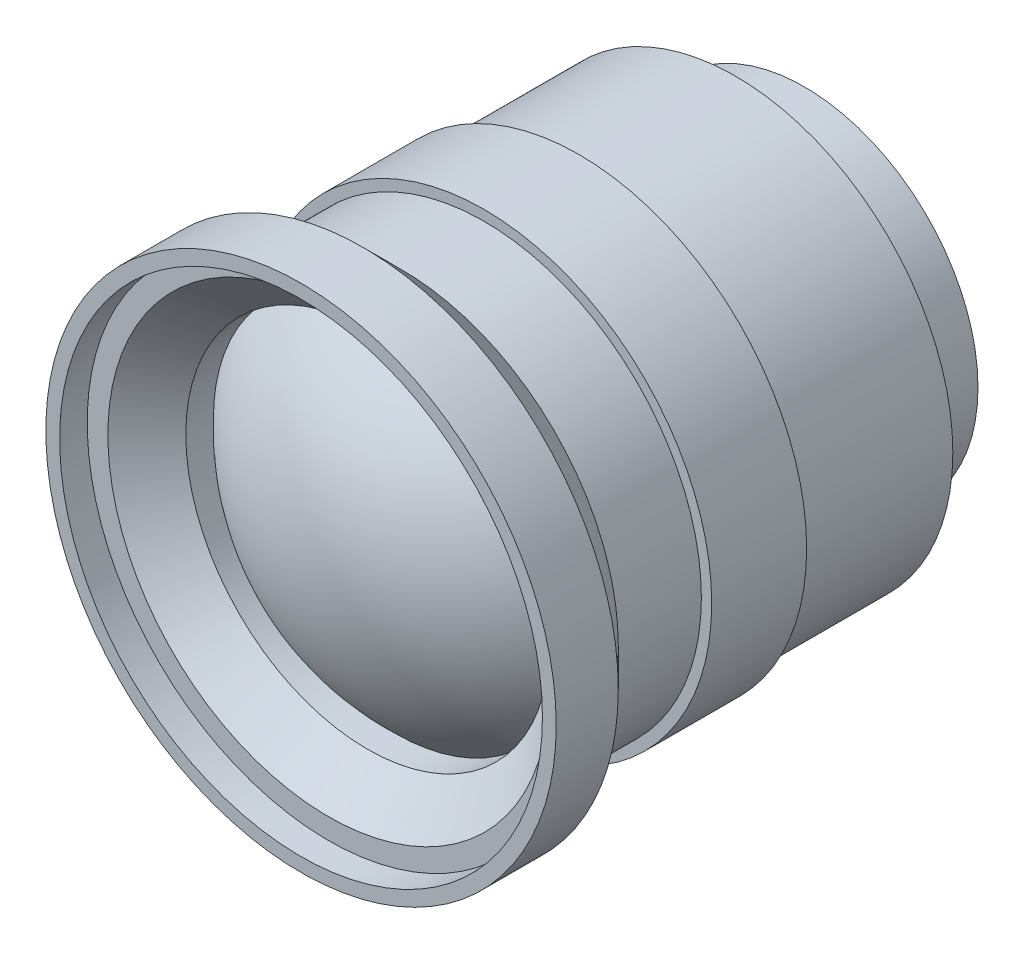
ISO-10303-21;
HEADER;
FILE_DESCRIPTION(('STEP AP214'),'2;1');
FILE_NAME('part.step','',(''),(''),'','','');
FILE_SCHEMA(('AUTOMOTIVE_DESIGN { 1 0 10303 214 1 1 1 1 }'));
ENDSEC;
DATA;
#1=APPLICATION_CONTEXT('core data for automotive mechanical design processes');
#2=APPLICATION_PROTOCOL_DEFINITION('international standard','automotive_design',2000,#1);
#3=PRODUCT_CONTEXT('',#1,'mechanical');
#4=PRODUCT('Part','Part','',(#3));
#5=PRODUCT_RELATED_PRODUCT_CATEGORY('part','',(#4));
#6=PRODUCT_DEFINITION_FORMATION('','',#4);
#7=PRODUCT_DEFINITION_CONTEXT('part definition',#1,'design');
#8=PRODUCT_DEFINITION('design','',#6,#7);
#9=PRODUCT_DEFINITION_SHAPE('','',#8);
#10=(LENGTH_UNIT() NAMED_UNIT(*) SI_UNIT(.MILLI.,.METRE.));
#11=(NAMED_UNIT(*) PLANE_ANGLE_UNIT() SI_UNIT($,.RADIAN.));
#12=(NAMED_UNIT(*) SI_UNIT($,.STERADIAN.) SOLID_ANGLE_UNIT());
#13=UNCERTAINTY_MEASURE_WITH_UNIT(LENGTH_MEASURE(1.E-05),#10,'distance_accuracy_value','');
#14=(GEOMETRIC_REPRESENTATION_CONTEXT(3) GLOBAL_UNCERTAINTY_ASSIGNED_CONTEXT((#13)) GLOBAL_UNIT_ASSIGNED_CONTEXT((#10,
#11,#12)) REPRESENTATION_CONTEXT('',''));
#15=CARTESIAN_POINT('',(0.,0.,0.));
#16=DIRECTION('',(0.,0.,1.));
#17=DIRECTION('',(1.,0.,0.));
#18=AXIS2_PLACEMENT_3D('',#15,#16,#17);
#19=CARTESIAN_POINT('',(0.,0.,0.));
#20=DIRECTION('',(0.,0.,1.));
#21=DIRECTION('',(1.,0.,0.));
#22=AXIS2_PLACEMENT_3D('',#19,#20,#21);
#23=PLANE('',#22);
#24=CARTESIAN_POINT('',(0.,0.,0.));
#25=DIRECTION('',(0.,0.,1.));
#26=DIRECTION('',(1.,0.,0.));
#27=AXIS2_PLACEMENT_3D('',#24,#25,#26);
#28=CIRCLE('',#27,12.575);
#29=CARTESIAN_POINT('',(12.575,0.,0.));
#30=VERTEX_POINT('',#29);
#31=EDGE_CURVE('E10',#30,#30,#28,.T.);
#32=ORIENTED_EDGE('',*,*,#31,.F.);
#33=EDGE_LOOP('',(#32));
#34=FACE_BOUND('',#33,.T.);
#35=ADVANCED_FACE('F34',(#34),#23,.F.);
#36=CARTESIAN_POINT('',(0.,0.,35.4613930078287));
#37=DIRECTION('',(0.,0.,1.));
#38=DIRECTION('',(1.,0.,0.));
#39=AXIS2_PLACEMENT_3D('',#36,#37,#38);
#40=CYLINDRICAL_SURFACE('',#39,12.575);
#41=CARTESIAN_POINT('',(0.,0.,5.));
#42=DIRECTION('',(0.,0.,1.));
#43=DIRECTION('',(1.,0.,0.));
#44=AXIS2_PLACEMENT_3D('',#41,#42,#43);
#45=CIRCLE('',#44,12.575);
#46=CARTESIAN_POINT('',(12.575,0.,5.));
#47=VERTEX_POINT('',#46);
#48=EDGE_CURVE('E40',#47,#47,#45,.T.);
#49=ORIENTED_EDGE('',*,*,#48,.F.);
#50=EDGE_LOOP('',(#49));
#51=FACE_BOUND('',#50,.T.);
#52=ORIENTED_EDGE('',*,*,#31,.T.);
#53=EDGE_LOOP('',(#52));
#54=FACE_BOUND('',#53,.T.);
#55=ADVANCED_FACE('F163',(#51,#54),#40,.T.);
#56=CARTESIAN_POINT('',(0.,12.575,5.));
#57=DIRECTION('',(0.,0.,1.));
#58=DIRECTION('',(1.,0.,0.));
#59=AXIS2_PLACEMENT_3D('',#56,#57,#58);
#60=PLANE('',#59);
#61=CARTESIAN_POINT('',(0.,0.,5.));
#62=DIRECTION('',(0.,0.,1.));
#63=DIRECTION('',(1.,0.,0.));
#64=AXIS2_PLACEMENT_3D('',#61,#62,#63);
#65=CIRCLE('',#64,15.75);
#66=CARTESIAN_POINT('',(15.75,0.,5.));
#67=VERTEX_POINT('',#66);
#68=EDGE_CURVE('E44',#67,#67,#65,.T.);
#69=ORIENTED_EDGE('',*,*,#68,.F.);
#70=EDGE_LOOP('',(#69));
#71=FACE_BOUND('',#70,.T.);
#72=ORIENTED_EDGE('',*,*,#48,.T.);
#73=EDGE_LOOP('',(#72));
#74=FACE_BOUND('',#73,.T.);
#75=ADVANCED_FACE('F158',(#71,#74),#60,.F.);
#76=CARTESIAN_POINT('',(0.,0.,35.4613930078287));
#77=DIRECTION('',(0.,0.,1.));
#78=DIRECTION('',(1.,0.,0.));
#79=AXIS2_PLACEMENT_3D('',#76,#77,#78);
#80=CYLINDRICAL_SURFACE('',#79,15.75);
#81=CARTESIAN_POINT('',(0.,0.,16.3454234331637));
#82=DIRECTION('',(0.,0.,1.));
#83=DIRECTION('',(1.,0.,0.));
#84=AXIS2_PLACEMENT_3D('',#81,#82,#83);
#85=CIRCLE('',#84,15.75);
#86=CARTESIAN_POINT('',(15.75,0.,16.3454234331637));
#87=VERTEX_POINT('',#86);
#88=EDGE_CURVE('E48',#87,#87,#85,.T.);
#89=ORIENTED_EDGE('',*,*,#88,.F.);
#90=EDGE_LOOP('',(#89));
#91=FACE_BOUND('',#90,.T.);
#92=ORIENTED_EDGE('',*,*,#68,.T.);
#93=EDGE_LOOP('',(#92));
#94=FACE_BOUND('',#93,.T.);
#95=ADVANCED_FACE('F152',(#91,#94),#80,.T.);
#96=CARTESIAN_POINT('',(0.,15.75,16.3454234331637));
#97=DIRECTION('',(0.,0.,1.));
#98=DIRECTION('',(1.,0.,0.));
#99=AXIS2_PLACEMENT_3D('',#96,#97,#98);
#100=PLANE('',#99);
#101=CARTESIAN_POINT('',(0.,0.,16.3454234331637));
#102=DIRECTION('',(0.,0.,1.));
#103=DIRECTION('',(1.,0.,0.));
#104=AXIS2_PLACEMENT_3D('',#101,#102,#103);
#105=CIRCLE('',#104,16.5);
#106=CARTESIAN_POINT('',(16.5,0.,16.3454234331637));
#107=VERTEX_POINT('',#106);
#108=EDGE_CURVE('E53',#107,#107,#105,.T.);
#109=ORIENTED_EDGE('',*,*,#108,.F.);
#110=EDGE_LOOP('',(#109));
#111=FACE_BOUND('',#110,.T.);
#112=ORIENTED_EDGE('',*,*,#88,.T.);
#113=EDGE_LOOP('',(#112));
#114=FACE_BOUND('',#113,.T.);
#115=ADVANCED_FACE('F146',(#111,#114),#100,.F.);
#116=CARTESIAN_POINT('',(0.,0.,35.4613930078287));
#117=DIRECTION('',(0.,0.,1.));
#118=DIRECTION('',(1.,0.,0.));
#119=AXIS2_PLACEMENT_3D('',#116,#117,#118);
#120=CYLINDRICAL_SURFACE('',#119,16.5);
#121=CARTESIAN_POINT('',(0.,0.,23.228752502532));
#122=DIRECTION('',(0.,0.,1.));
#123=DIRECTION('',(1.,0.,0.));
#124=AXIS2_PLACEMENT_3D('',#121,#122,#123);
#125=CIRCLE('',#124,16.5);
#126=CARTESIAN_POINT('',(16.5,0.,23.228752502532));
#127=VERTEX_POINT('',#126);
#128=EDGE_CURVE('E56',#127,#127,#125,.T.);
#129=ORIENTED_EDGE('',*,*,#128,.F.);
#130=EDGE_LOOP('',(#129));
#131=FACE_BOUND('',#130,.T.);
#132=ORIENTED_EDGE('',*,*,#108,.T.);
#133=EDGE_LOOP('',(#132));
#134=FACE_BOUND('',#133,.T.);
#135=ADVANCED_FACE('F140',(#131,#134),#120,.T.);
#136=CARTESIAN_POINT('',(0.,16.5,23.228752502532));
#137=DIRECTION('',(0.,0.,-1.));
#138=DIRECTION('',(-1.,0.,0.));
#139=AXIS2_PLACEMENT_3D('',#136,#137,#138);
#140=PLANE('',#139);
#141=CARTESIAN_POINT('',(0.,0.,23.228752502532));
#142=DIRECTION('',(0.,0.,1.));
#143=DIRECTION('',(1.,0.,0.));
#144=AXIS2_PLACEMENT_3D('',#141,#142,#143);
#145=CIRCLE('',#144,15.75);
#146=CARTESIAN_POINT('',(15.75,0.,23.228752502532));
#147=VERTEX_POINT('',#146);
#148=EDGE_CURVE('E59',#147,#147,#145,.T.);
#149=ORIENTED_EDGE('',*,*,#148,.F.);
#150=EDGE_LOOP('',(#149));
#151=FACE_BOUND('',#150,.T.);
#152=ORIENTED_EDGE('',*,*,#128,.T.);
#153=EDGE_LOOP('',(#152));
#154=FACE_BOUND('',#153,.T.);
#155=ADVANCED_FACE('F134',(#151,#154),#140,.F.);
#156=CARTESIAN_POINT('',(0.,0.,35.4613930078287));
#157=DIRECTION('',(0.,0.,1.));
#158=DIRECTION('',(1.,0.,0.));
#159=AXIS2_PLACEMENT_3D('',#156,#157,#158);
#160=CYLINDRICAL_SURFACE('',#159,15.75);
#161=CARTESIAN_POINT('',(0.,0.,29.2516654382292));
#162=DIRECTION('',(0.,0.,1.));
#163=DIRECTION('',(1.,0.,0.));
#164=AXIS2_PLACEMENT_3D('',#161,#162,#163);
#165=CIRCLE('',#164,15.75);
#166=CARTESIAN_POINT('',(15.75,0.,29.2516654382292));
#167=VERTEX_POINT('',#166);
#168=EDGE_CURVE('E62',#167,#167,#165,.T.);
#169=ORIENTED_EDGE('',*,*,#168,.F.);
#170=EDGE_LOOP('',(#169));
#171=FACE_BOUND('',#170,.T.);
#172=ORIENTED_EDGE('',*,*,#148,.T.);
#173=EDGE_LOOP('',(#172));
#174=FACE_BOUND('',#173,.T.);
#175=ADVANCED_FACE('F128',(#171,#174),#160,.T.);
#176=CARTESIAN_POINT('',(0.,0.,29.2516654382292));
#177=DIRECTION('',(0.,0.,1.));
#178=DIRECTION('',(1.,0.,0.));
#179=AXIS2_PLACEMENT_3D('',#176,#177,#178);
#180=CONICAL_SURFACE('',#179,15.75,0.78539816339745);
#181=CARTESIAN_POINT('',(0.,0.,32.0016654382292));
#182=DIRECTION('',(0.,0.,1.));
#183=DIRECTION('',(1.,0.,0.));
#184=AXIS2_PLACEMENT_3D('',#181,#182,#183);
#185=CIRCLE('',#184,18.5);
#186=CARTESIAN_POINT('',(18.5,0.,32.0016654382292));
#187=VERTEX_POINT('',#186);
#188=EDGE_CURVE('E65',#187,#187,#185,.T.);
#189=ORIENTED_EDGE('',*,*,#188,.F.);
#190=EDGE_LOOP('',(#189));
#191=FACE_BOUND('',#190,.T.);
#192=ORIENTED_EDGE('',*,*,#168,.T.);
#193=EDGE_LOOP('',(#192));
#194=FACE_BOUND('',#193,.T.);
#195=ADVANCED_FACE('F122',(#191,#194),#180,.T.);
#196=CARTESIAN_POINT('',(0.,0.,35.4613930078287));
#197=DIRECTION('',(0.,0.,1.));
#198=DIRECTION('',(1.,0.,0.));
#199=AXIS2_PLACEMENT_3D('',#196,#197,#198);
#200=CYLINDRICAL_SURFACE('',#199,18.5);
#201=CARTESIAN_POINT('',(0.,0.,36.5));
#202=DIRECTION('',(0.,0.,1.));
#203=DIRECTION('',(1.,0.,0.));
#204=AXIS2_PLACEMENT_3D('',#201,#202,#203);
#205=CIRCLE('',#204,18.5);
#206=CARTESIAN_POINT('',(18.5,0.,36.5));
#207=VERTEX_POINT('',#206);
#208=EDGE_CURVE('E68',#207,#207,#205,.T.);
#209=ORIENTED_EDGE('',*,*,#208,.F.);
#210=EDGE_LOOP('',(#209));
#211=FACE_BOUND('',#210,.T.);
#212=ORIENTED_EDGE('',*,*,#188,.T.);
#213=EDGE_LOOP('',(#212));
#214=FACE_BOUND('',#213,.T.);
#215=ADVANCED_FACE('F116',(#211,#214),#200,.T.);
#216=CARTESIAN_POINT('',(0.,18.5,36.5));
#217=DIRECTION('',(0.,0.,-1.));
#218=DIRECTION('',(-1.,0.,0.));
#219=AXIS2_PLACEMENT_3D('',#216,#217,#218);
#220=PLANE('',#219);
#221=CARTESIAN_POINT('',(0.,0.,36.5));
#222=DIRECTION('',(0.,0.,1.));
#223=DIRECTION('',(1.,0.,0.));
#224=AXIS2_PLACEMENT_3D('',#221,#222,#223);
#225=CIRCLE('',#224,17.5);
#226=CARTESIAN_POINT('',(17.5,0.,36.5));
#227=VERTEX_POINT('',#226);
#228=EDGE_CURVE('E71',#227,#227,#225,.T.);
#229=ORIENTED_EDGE('',*,*,#228,.F.);
#230=EDGE_LOOP('',(#229));
#231=FACE_BOUND('',#230,.T.);
#232=ORIENTED_EDGE('',*,*,#208,.T.);
#233=EDGE_LOOP('',(#232));
#234=FACE_BOUND('',#233,.T.);
#235=ADVANCED_FACE('F110',(#231,#234),#220,.F.);
#236=CARTESIAN_POINT('',(0.,0.,35.4613930078287));
#237=DIRECTION('',(0.,0.,1.));
#238=DIRECTION('',(1.,0.,0.));
#239=AXIS2_PLACEMENT_3D('',#236,#237,#238);
#240=CYLINDRICAL_SURFACE('',#239,17.5);
#241=CARTESIAN_POINT('',(0.,0.,34.5));
#242=DIRECTION('',(0.,0.,1.));
#243=DIRECTION('',(1.,0.,0.));
#244=AXIS2_PLACEMENT_3D('',#241,#242,#243);
#245=CIRCLE('',#244,17.5);
#246=CARTESIAN_POINT('',(17.5,0.,34.5));
#247=VERTEX_POINT('',#246);
#248=EDGE_CURVE('E74',#247,#247,#245,.T.);
#249=ORIENTED_EDGE('',*,*,#248,.F.);
#250=EDGE_LOOP('',(#249));
#251=FACE_BOUND('',#250,.T.);
#252=ORIENTED_EDGE('',*,*,#228,.T.);
#253=EDGE_LOOP('',(#252));
#254=FACE_BOUND('',#253,.T.);
#255=ADVANCED_FACE('F104',(#251,#254),#240,.F.);
#256=CARTESIAN_POINT('',(0.,17.5,34.5));
#257=DIRECTION('',(0.,0.,-1.));
#258=DIRECTION('',(-1.,0.,0.));
#259=AXIS2_PLACEMENT_3D('',#256,#257,#258);
#260=PLANE('',#259);
#261=CARTESIAN_POINT('',(0.,0.,34.5));
#262=DIRECTION('',(0.,0.,1.));
#263=DIRECTION('',(1.,0.,0.));
#264=AXIS2_PLACEMENT_3D('',#261,#262,#263);
#265=CIRCLE('',#264,16.);
#266=CARTESIAN_POINT('',(16.,0.,34.5));
#267=VERTEX_POINT('',#266);
#268=EDGE_CURVE('E77',#267,#267,#265,.T.);
#269=ORIENTED_EDGE('',*,*,#268,.F.);
#270=EDGE_LOOP('',(#269));
#271=FACE_BOUND('',#270,.T.);
#272=ORIENTED_EDGE('',*,*,#248,.T.);
#273=EDGE_LOOP('',(#272));
#274=FACE_BOUND('',#273,.T.);
#275=ADVANCED_FACE('F98',(#271,#274),#260,.F.);
#276=CARTESIAN_POINT('',(0.,0.,34.5));
#277=DIRECTION('',(0.,0.,1.));
#278=DIRECTION('',(1.,0.,0.));
#279=AXIS2_PLACEMENT_3D('',#276,#277,#278);
#280=CONICAL_SURFACE('',#279,16.,0.78539816339745);
#281=CARTESIAN_POINT('',(0.,0.,31.6760379405644));
#282=DIRECTION('',(0.,0.,1.));
#283=DIRECTION('',(1.,0.,0.));
#284=AXIS2_PLACEMENT_3D('',#281,#282,#283);
#285=CIRCLE('',#284,13.1760379405644);
#286=CARTESIAN_POINT('',(13.1760379405644,0.,31.6760379405644));
#287=VERTEX_POINT('',#286);
#288=EDGE_CURVE('E80',#287,#287,#285,.T.);
#289=ORIENTED_EDGE('',*,*,#288,.F.);
#290=EDGE_LOOP('',(#289));
#291=FACE_BOUND('',#290,.T.);
#292=ORIENTED_EDGE('',*,*,#268,.T.);
#293=EDGE_LOOP('',(#292));
#294=FACE_BOUND('',#293,.T.);
#295=ADVANCED_FACE('F92',(#291,#294),#280,.F.);
#296=CARTESIAN_POINT('',(0.,0.,35.4613930078287));
#297=DIRECTION('',(0.,0.,1.));
#298=DIRECTION('',(1.,0.,0.));
#299=AXIS2_PLACEMENT_3D('',#296,#297,#298);
#300=CYLINDRICAL_SURFACE('',#299,13.1760379405644);
#301=CARTESIAN_POINT('',(0.,0.,29.6760379405644));
#302=DIRECTION('',(0.,0.,1.));
#303=DIRECTION('',(1.,0.,0.));
#304=AXIS2_PLACEMENT_3D('',#301,#302,#303);
#305=CIRCLE('',#304,13.1760379405644);
#306=CARTESIAN_POINT('',(13.1760379405644,0.,29.6760379405644));
#307=VERTEX_POINT('',#306);
#308=EDGE_CURVE('E83',#307,#307,#305,.T.);
#309=ORIENTED_EDGE('',*,*,#308,.F.);
#310=EDGE_LOOP('',(#309));
#311=FACE_BOUND('',#310,.T.);
#312=ORIENTED_EDGE('',*,*,#288,.T.);
#313=EDGE_LOOP('',(#312));
#314=FACE_BOUND('',#313,.T.);
#315=ADVANCED_FACE('F89',(#311,#314),#300,.F.);
#316=CARTESIAN_POINT('',(0.,0.,17.5646255097333));
#317=DIRECTION('',(0.,0.,1.));
#318=DIRECTION('',(0.,1.,0.));
#319=AXIS2_PLACEMENT_3D('',#316,#317,#318);
#320=SPHERICAL_SURFACE('',#319,17.8967674980954);
#321=ORIENTED_EDGE('',*,*,#308,.T.);
#322=EDGE_LOOP('',(#321));
#323=FACE_BOUND('',#322,.T.);
#324=ADVANCED_FACE('F87',(#323),#320,.T.);
#325=CLOSED_SHELL('',(#35,#55,#75,#95,#115,#135,#155,#175,#195,#215,#235,#255,#275,#295,#315,#324));
#326=MANIFOLD_SOLID_BREP('B2',#325);
#327=ADVANCED_BREP_SHAPE_REPRESENTATION('',(#18,#326),#14);
#328=SHAPE_DEFINITION_REPRESENTATION(#9,#327);
ENDSEC;
END-ISO-10303-21;
